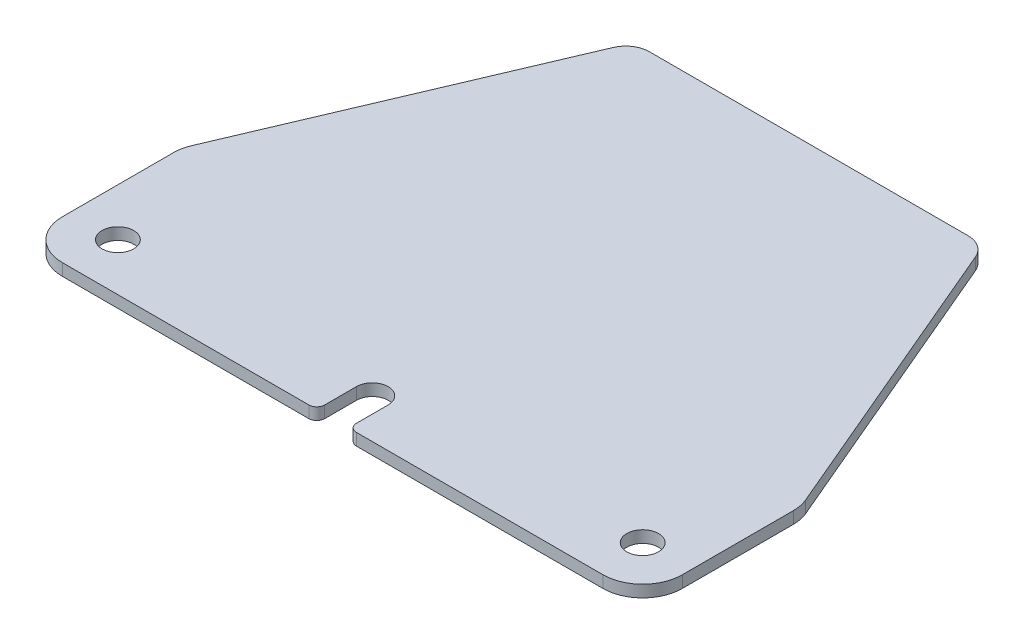
ISO-10303-21;
HEADER;
FILE_DESCRIPTION(('STEP AP214'),'2;1');
FILE_NAME('part.step','',(''),(''),'','','');
FILE_SCHEMA(('AUTOMOTIVE_DESIGN { 1 0 10303 214 1 1 1 1 }'));
ENDSEC;
DATA;
#1=APPLICATION_CONTEXT('core data for automotive mechanical design processes');
#2=APPLICATION_PROTOCOL_DEFINITION('international standard','automotive_design',2000,#1);
#3=PRODUCT_CONTEXT('',#1,'mechanical');
#4=PRODUCT('Part','Part','',(#3));
#5=PRODUCT_RELATED_PRODUCT_CATEGORY('part','',(#4));
#6=PRODUCT_DEFINITION_FORMATION('','',#4);
#7=PRODUCT_DEFINITION_CONTEXT('part definition',#1,'design');
#8=PRODUCT_DEFINITION('design','',#6,#7);
#9=PRODUCT_DEFINITION_SHAPE('','',#8);
#10=(LENGTH_UNIT() NAMED_UNIT(*) SI_UNIT(.MILLI.,.METRE.));
#11=(NAMED_UNIT(*) PLANE_ANGLE_UNIT() SI_UNIT($,.RADIAN.));
#12=(NAMED_UNIT(*) SI_UNIT($,.STERADIAN.) SOLID_ANGLE_UNIT());
#13=UNCERTAINTY_MEASURE_WITH_UNIT(LENGTH_MEASURE(1.E-05),#10,'distance_accuracy_value','');
#14=(GEOMETRIC_REPRESENTATION_CONTEXT(3) GLOBAL_UNCERTAINTY_ASSIGNED_CONTEXT((#13)) GLOBAL_UNIT_ASSIGNED_CONTEXT((#10,
#11,#12)) REPRESENTATION_CONTEXT('',''));
#15=CARTESIAN_POINT('',(0.,0.,0.));
#16=DIRECTION('',(0.,0.,1.));
#17=DIRECTION('',(1.,0.,0.));
#18=AXIS2_PLACEMENT_3D('',#15,#16,#17);
#19=CARTESIAN_POINT('',(-17.7,-1.5,60.));
#20=DIRECTION('',(0.,0.,1.));
#21=DIRECTION('',(1.,0.,0.));
#22=AXIS2_PLACEMENT_3D('',#19,#20,#21);
#23=PLANE('',#22);
#24=DIRECTION('',(1.,0.,0.));
#25=VECTOR('',#24,1.);
#26=CARTESIAN_POINT('',(-17.7,0.,60.));
#27=LINE('',#26,#25);
#28=CARTESIAN_POINT('',(2.99999999999999,0.,60.));
#29=VERTEX_POINT('',#28);
#30=CARTESIAN_POINT('',(34.0619458194133,1.00613961606655E-13,60.));
#31=VERTEX_POINT('',#30);
#32=EDGE_CURVE('E185',#29,#31,#27,.T.);
#33=ORIENTED_EDGE('',*,*,#32,.F.);
#34=DIRECTION('',(0.,1.,0.));
#35=VECTOR('',#34,1.);
#36=CARTESIAN_POINT('',(2.99999999999999,-1.5,60.));
#37=LINE('',#36,#35);
#38=CARTESIAN_POINT('',(2.99999999999999,-1.5,60.));
#39=VERTEX_POINT('',#38);
#40=EDGE_CURVE('E12',#29,#39,#37,.F.);
#41=ORIENTED_EDGE('',*,*,#40,.T.);
#42=DIRECTION('',(1.,0.,0.));
#43=VECTOR('',#42,1.);
#44=CARTESIAN_POINT('',(-17.7,-1.5,60.));
#45=LINE('',#44,#43);
#46=CARTESIAN_POINT('',(34.0619458194133,-1.4999999999999,60.));
#47=VERTEX_POINT('',#46);
#48=EDGE_CURVE('E345',#39,#47,#45,.T.);
#49=ORIENTED_EDGE('',*,*,#48,.T.);
#50=DIRECTION('',(0.,-1.,0.));
#51=VECTOR('',#50,1.);
#52=CARTESIAN_POINT('',(34.0619458194133,1.00613961606655E-13,60.));
#53=LINE('',#52,#51);
#54=EDGE_CURVE('E293',#31,#47,#53,.T.);
#55=ORIENTED_EDGE('',*,*,#54,.F.);
#56=EDGE_LOOP('',(#33,#41,#49,#55));
#57=FACE_BOUND('',#56,.T.);
#58=ADVANCED_FACE('F47',(#57),#23,.T.);
#59=CARTESIAN_POINT('',(0.,-1.5,0.));
#60=DIRECTION('',(0.,0.,-1.));
#61=DIRECTION('',(-1.,0.,0.));
#62=AXIS2_PLACEMENT_3D('',#59,#60,#61);
#63=PLANE('',#62);
#64=DIRECTION('',(-1.,0.,0.));
#65=VECTOR('',#64,1.);
#66=CARTESIAN_POINT('',(0.,-1.5,0.));
#67=LINE('',#66,#65);
#68=CARTESIAN_POINT('',(20.0772487475981,-1.49999999999999,0.));
#69=VERTEX_POINT('',#68);
#70=CARTESIAN_POINT('',(-20.0772487475981,-1.49999999999999,0.));
#71=VERTEX_POINT('',#70);
#72=EDGE_CURVE('E184',#69,#71,#67,.T.);
#73=ORIENTED_EDGE('',*,*,#72,.T.);
#74=DIRECTION('',(0.,1.,0.));
#75=VECTOR('',#74,1.);
#76=CARTESIAN_POINT('',(-20.0772487475981,0.,0.));
#77=LINE('',#76,#75);
#78=CARTESIAN_POINT('',(-20.0772487475981,0.,0.));
#79=VERTEX_POINT('',#78);
#80=EDGE_CURVE('E196',#71,#79,#77,.T.);
#81=ORIENTED_EDGE('',*,*,#80,.T.);
#82=DIRECTION('',(-1.,0.,0.));
#83=VECTOR('',#82,1.);
#84=CARTESIAN_POINT('',(0.,0.,0.));
#85=LINE('',#84,#83);
#86=CARTESIAN_POINT('',(20.0772487475981,0.,0.));
#87=VERTEX_POINT('',#86);
#88=EDGE_CURVE('E342',#87,#79,#85,.T.);
#89=ORIENTED_EDGE('',*,*,#88,.F.);
#90=DIRECTION('',(0.,1.,0.));
#91=VECTOR('',#90,1.);
#92=CARTESIAN_POINT('',(20.0772487475981,0.,0.));
#93=LINE('',#92,#91);
#94=EDGE_CURVE('E308',#69,#87,#93,.T.);
#95=ORIENTED_EDGE('',*,*,#94,.F.);
#96=EDGE_LOOP('',(#73,#81,#89,#95));
#97=FACE_BOUND('',#96,.T.);
#98=ADVANCED_FACE('F400',(#97),#63,.T.);
#99=CARTESIAN_POINT('',(0.,-1.5,0.));
#100=DIRECTION('',(0.,1.,0.));
#101=DIRECTION('',(0.,0.,1.));
#102=AXIS2_PLACEMENT_3D('',#99,#100,#101);
#103=PLANE('',#102);
#104=DIRECTION('',(0.,0.,-1.));
#105=VECTOR('',#104,1.);
#106=CARTESIAN_POINT('',(-1.99999999999999,-1.5,55.));
#107=LINE('',#106,#105);
#108=CARTESIAN_POINT('',(-1.99999999999999,-1.5,59.));
#109=VERTEX_POINT('',#108);
#110=CARTESIAN_POINT('',(-1.99999999999999,-1.5,55.));
#111=VERTEX_POINT('',#110);
#112=EDGE_CURVE('E323',#109,#111,#107,.T.);
#113=ORIENTED_EDGE('',*,*,#112,.F.);
#114=CARTESIAN_POINT('',(-2.99999999999999,-1.5,59.));
#115=DIRECTION('',(0.,1.,0.));
#116=DIRECTION('',(0.,0.,1.));
#117=AXIS2_PLACEMENT_3D('',#114,#115,#116);
#118=CIRCLE('',#117,1.);
#119=CARTESIAN_POINT('',(-2.99999999999999,-1.5,60.));
#120=VERTEX_POINT('',#119);
#121=EDGE_CURVE('E364',#109,#120,#118,.F.);
#122=ORIENTED_EDGE('',*,*,#121,.T.);
#123=CARTESIAN_POINT('',(-34.0619458194133,-1.4999999999999,60.));
#124=VERTEX_POINT('',#123);
#125=EDGE_CURVE('E346',#124,#120,#45,.T.);
#126=ORIENTED_EDGE('',*,*,#125,.F.);
#127=CARTESIAN_POINT('',(-34.0619458194133,-1.4999999999999,55.));
#128=DIRECTION('',(0.,-1.,0.));
#129=DIRECTION('',(1.,0.,0.));
#130=AXIS2_PLACEMENT_3D('',#127,#128,#129);
#131=CIRCLE('',#130,5.);
#132=CARTESIAN_POINT('',(-39.0619458194133,-1.49999999999987,55.));
#133=VERTEX_POINT('',#132);
#134=EDGE_CURVE('E200',#124,#133,#131,.T.);
#135=ORIENTED_EDGE('',*,*,#134,.T.);
#136=DIRECTION('',(0.,0.,1.));
#137=VECTOR('',#136,1.);
#138=CARTESIAN_POINT('',(-39.0619458194133,-1.49999999999987,60.));
#139=LINE('',#138,#137);
#140=CARTESIAN_POINT('',(-39.0619458194133,-1.49999999999986,41.018419889471));
#141=VERTEX_POINT('',#140);
#142=EDGE_CURVE('E240',#141,#133,#139,.T.);
#143=ORIENTED_EDGE('',*,*,#142,.F.);
#144=CARTESIAN_POINT('',(-34.0619458194133,-1.4999999999999,41.018419889471));
#145=DIRECTION('',(0.,-1.,0.));
#146=DIRECTION('',(1.,0.,0.));
#147=AXIS2_PLACEMENT_3D('',#144,#145,#146);
#148=CIRCLE('',#147,5.);
#149=CARTESIAN_POINT('',(-38.6636004117057,-1.49999999999986,39.0627166877468));
#150=VERTEX_POINT('',#149);
#151=EDGE_CURVE('E203',#141,#150,#148,.T.);
#152=ORIENTED_EDGE('',*,*,#151,.T.);
#153=DIRECTION('',(-0.391140640344853,0.,0.920330918458474));
#154=VECTOR('',#153,1.);
#155=CARTESIAN_POINT('',(-22.0619458194132,-1.49999999999997,0.));
#156=LINE('',#155,#154);
#157=CARTESIAN_POINT('',(-22.8382415029736,-1.49999999999997,1.82657807896544));
#158=VERTEX_POINT('',#157);
#159=EDGE_CURVE('E231',#158,#150,#156,.T.);
#160=ORIENTED_EDGE('',*,*,#159,.F.);
#161=CARTESIAN_POINT('',(-20.0772487475981,-1.49999999999999,3.));
#162=DIRECTION('',(0.,-1.,0.));
#163=DIRECTION('',(1.,0.,0.));
#164=AXIS2_PLACEMENT_3D('',#161,#162,#163);
#165=CIRCLE('',#164,3.);
#166=EDGE_CURVE('E215',#158,#71,#165,.T.);
#167=ORIENTED_EDGE('',*,*,#166,.T.);
#168=ORIENTED_EDGE('',*,*,#72,.F.);
#169=CARTESIAN_POINT('',(20.0772487475981,-1.49999999999999,3.));
#170=DIRECTION('',(0.,1.,0.));
#171=DIRECTION('',(-1.,0.,0.));
#172=AXIS2_PLACEMENT_3D('',#169,#170,#171);
#173=CIRCLE('',#172,3.);
#174=CARTESIAN_POINT('',(22.8382415029736,-1.49999999999997,1.82657807896544));
#175=VERTEX_POINT('',#174);
#176=EDGE_CURVE('E312',#175,#69,#173,.T.);
#177=ORIENTED_EDGE('',*,*,#176,.F.);
#178=DIRECTION('',(0.391140640344853,0.,0.920330918458474));
#179=VECTOR('',#178,1.);
#180=CARTESIAN_POINT('',(22.0619458194132,-1.49999999999997,0.));
#181=LINE('',#180,#179);
#182=CARTESIAN_POINT('',(38.6636004117057,-1.49999999999986,39.0627166877468));
#183=VERTEX_POINT('',#182);
#184=EDGE_CURVE('E256',#175,#183,#181,.T.);
#185=ORIENTED_EDGE('',*,*,#184,.T.);
#186=CARTESIAN_POINT('',(34.0619458194133,-1.4999999999999,41.018419889471));
#187=DIRECTION('',(0.,1.,0.));
#188=DIRECTION('',(-1.,0.,0.));
#189=AXIS2_PLACEMENT_3D('',#186,#187,#188);
#190=CIRCLE('',#189,5.);
#191=CARTESIAN_POINT('',(39.0619458194133,-1.49999999999986,41.018419889471));
#192=VERTEX_POINT('',#191);
#193=EDGE_CURVE('E278',#192,#183,#190,.T.);
#194=ORIENTED_EDGE('',*,*,#193,.F.);
#195=DIRECTION('',(0.,0.,1.));
#196=VECTOR('',#195,1.);
#197=CARTESIAN_POINT('',(39.0619458194133,-1.49999999999987,60.));
#198=LINE('',#197,#196);
#199=CARTESIAN_POINT('',(39.0619458194133,-1.49999999999987,55.));
#200=VERTEX_POINT('',#199);
#201=EDGE_CURVE('E252',#192,#200,#198,.T.);
#202=ORIENTED_EDGE('',*,*,#201,.T.);
#203=CARTESIAN_POINT('',(34.0619458194133,-1.4999999999999,55.));
#204=DIRECTION('',(0.,1.,0.));
#205=DIRECTION('',(-1.,0.,0.));
#206=AXIS2_PLACEMENT_3D('',#203,#204,#205);
#207=CIRCLE('',#206,5.);
#208=EDGE_CURVE('E289',#47,#200,#207,.T.);
#209=ORIENTED_EDGE('',*,*,#208,.F.);
#210=ORIENTED_EDGE('',*,*,#48,.F.);
#211=CARTESIAN_POINT('',(2.99999999999999,-1.5,59.));
#212=DIRECTION('',(0.,1.,0.));
#213=DIRECTION('',(0.,0.,1.));
#214=AXIS2_PLACEMENT_3D('',#211,#212,#213);
#215=CIRCLE('',#214,1.);
#216=CARTESIAN_POINT('',(1.99999999999999,-1.5,59.));
#217=VERTEX_POINT('',#216);
#218=EDGE_CURVE('E63',#39,#217,#215,.F.);
#219=ORIENTED_EDGE('',*,*,#218,.T.);
#220=DIRECTION('',(0.,0.,1.));
#221=VECTOR('',#220,1.);
#222=CARTESIAN_POINT('',(1.99999999999999,-1.5,55.));
#223=LINE('',#222,#221);
#224=CARTESIAN_POINT('',(1.99999999999999,-1.5,55.));
#225=VERTEX_POINT('',#224);
#226=EDGE_CURVE('E316',#225,#217,#223,.T.);
#227=ORIENTED_EDGE('',*,*,#226,.F.);
#228=CARTESIAN_POINT('',(0.,-1.5,55.));
#229=DIRECTION('',(0.,1.,0.));
#230=DIRECTION('',(0.,0.,1.));
#231=AXIS2_PLACEMENT_3D('',#228,#229,#230);
#232=CIRCLE('',#231,1.99999999999999);
#233=EDGE_CURVE('E319',#111,#225,#232,.F.);
#234=ORIENTED_EDGE('',*,*,#233,.F.);
#235=EDGE_LOOP('',(#113,#122,#126,#135,#143,#152,#160,#167,#168,#177,#185,#194,#202,#209,#210,
#219,#227,#234));
#236=FACE_BOUND('',#235,.T.);
#237=CARTESIAN_POINT('',(33.0619458194133,-1.49999999999991,54.));
#238=DIRECTION('',(0.,1.,0.));
#239=DIRECTION('',(-1.,0.,0.));
#240=AXIS2_PLACEMENT_3D('',#237,#238,#239);
#241=CIRCLE('',#240,2.);
#242=CARTESIAN_POINT('',(31.0619458194133,-1.49999999999992,54.));
#243=VERTEX_POINT('',#242);
#244=EDGE_CURVE('E260',#243,#243,#241,.F.);
#245=ORIENTED_EDGE('',*,*,#244,.F.);
#246=EDGE_LOOP('',(#245));
#247=FACE_BOUND('',#246,.T.);
#248=CARTESIAN_POINT('',(-33.0619458194133,-1.49999999999991,54.));
#249=DIRECTION('',(0.,-1.,0.));
#250=DIRECTION('',(1.,0.,0.));
#251=AXIS2_PLACEMENT_3D('',#248,#249,#250);
#252=CIRCLE('',#251,2.);
#253=CARTESIAN_POINT('',(-31.0619458194133,-1.49999999999992,54.));
#254=VERTEX_POINT('',#253);
#255=EDGE_CURVE('E219',#254,#254,#252,.F.);
#256=ORIENTED_EDGE('',*,*,#255,.T.);
#257=EDGE_LOOP('',(#256));
#258=FACE_BOUND('',#257,.T.);
#259=ADVANCED_FACE('F381',(#236,#247,#258),#103,.F.);
#260=CARTESIAN_POINT('',(0.,0.,0.));
#261=DIRECTION('',(0.,1.,0.));
#262=DIRECTION('',(0.,0.,1.));
#263=AXIS2_PLACEMENT_3D('',#260,#261,#262);
#264=PLANE('',#263);
#265=CARTESIAN_POINT('',(-34.0619458194133,1.00613961606655E-13,60.));
#266=VERTEX_POINT('',#265);
#267=CARTESIAN_POINT('',(-2.99999999999999,0.,60.));
#268=VERTEX_POINT('',#267);
#269=EDGE_CURVE('E174',#266,#268,#27,.T.);
#270=ORIENTED_EDGE('',*,*,#269,.T.);
#271=CARTESIAN_POINT('',(-2.99999999999999,0.,59.));
#272=DIRECTION('',(0.,1.,0.));
#273=DIRECTION('',(0.,0.,1.));
#274=AXIS2_PLACEMENT_3D('',#271,#272,#273);
#275=CIRCLE('',#274,1.);
#276=CARTESIAN_POINT('',(-1.99999999999999,0.,59.));
#277=VERTEX_POINT('',#276);
#278=EDGE_CURVE('E356',#268,#277,#275,.T.);
#279=ORIENTED_EDGE('',*,*,#278,.T.);
#280=DIRECTION('',(0.,0.,1.));
#281=VECTOR('',#280,1.);
#282=CARTESIAN_POINT('',(-1.99999999999999,0.,55.));
#283=LINE('',#282,#281);
#284=CARTESIAN_POINT('',(-1.99999999999999,0.,55.));
#285=VERTEX_POINT('',#284);
#286=EDGE_CURVE('E327',#285,#277,#283,.T.);
#287=ORIENTED_EDGE('',*,*,#286,.F.);
#288=CARTESIAN_POINT('',(0.,0.,55.));
#289=DIRECTION('',(0.,1.,0.));
#290=DIRECTION('',(0.,0.,1.));
#291=AXIS2_PLACEMENT_3D('',#288,#289,#290);
#292=CIRCLE('',#291,1.99999999999999);
#293=CARTESIAN_POINT('',(1.99999999999999,0.,55.));
#294=VERTEX_POINT('',#293);
#295=EDGE_CURVE('E251',#294,#285,#292,.T.);
#296=ORIENTED_EDGE('',*,*,#295,.F.);
#297=DIRECTION('',(0.,0.,-1.));
#298=VECTOR('',#297,1.);
#299=CARTESIAN_POINT('',(1.99999999999999,0.,55.));
#300=LINE('',#299,#298);
#301=CARTESIAN_POINT('',(1.99999999999999,0.,59.));
#302=VERTEX_POINT('',#301);
#303=EDGE_CURVE('E331',#302,#294,#300,.T.);
#304=ORIENTED_EDGE('',*,*,#303,.F.);
#305=CARTESIAN_POINT('',(2.99999999999999,0.,59.));
#306=DIRECTION('',(0.,1.,0.));
#307=DIRECTION('',(0.,0.,1.));
#308=AXIS2_PLACEMENT_3D('',#305,#306,#307);
#309=CIRCLE('',#308,1.);
#310=EDGE_CURVE('E353',#302,#29,#309,.T.);
#311=ORIENTED_EDGE('',*,*,#310,.T.);
#312=ORIENTED_EDGE('',*,*,#32,.T.);
#313=CARTESIAN_POINT('',(34.0619458194133,1.00613961606655E-13,55.));
#314=DIRECTION('',(0.,1.,0.));
#315=DIRECTION('',(-1.,0.,0.));
#316=AXIS2_PLACEMENT_3D('',#313,#314,#315);
#317=CIRCLE('',#316,5.);
#318=CARTESIAN_POINT('',(39.0619458194133,1.35308431126191E-13,55.));
#319=VERTEX_POINT('',#318);
#320=EDGE_CURVE('E297',#319,#31,#317,.F.);
#321=ORIENTED_EDGE('',*,*,#320,.F.);
#322=DIRECTION('',(0.,0.,1.));
#323=VECTOR('',#322,1.);
#324=CARTESIAN_POINT('',(39.0619458194133,1.35308431126191E-13,60.));
#325=LINE('',#324,#323);
#326=CARTESIAN_POINT('',(39.0619458194133,1.38777878078145E-13,41.018419889471));
#327=VERTEX_POINT('',#326);
#328=EDGE_CURVE('E282',#327,#319,#325,.T.);
#329=ORIENTED_EDGE('',*,*,#328,.F.);
#330=CARTESIAN_POINT('',(34.0619458194133,1.00613961606655E-13,41.018419889471));
#331=DIRECTION('',(0.,1.,0.));
#332=DIRECTION('',(-1.,0.,0.));
#333=AXIS2_PLACEMENT_3D('',#330,#331,#332);
#334=CIRCLE('',#333,5.);
#335=CARTESIAN_POINT('',(38.6636004117057,1.35308431126191E-13,39.0627166877468));
#336=VERTEX_POINT('',#335);
#337=EDGE_CURVE('E271',#336,#327,#334,.F.);
#338=ORIENTED_EDGE('',*,*,#337,.F.);
#339=DIRECTION('',(0.391140640344853,0.,0.920330918458474));
#340=VECTOR('',#339,1.);
#341=CARTESIAN_POINT('',(22.0619458194132,0.,0.));
#342=LINE('',#341,#340);
#343=CARTESIAN_POINT('',(22.8382415029735,0.,1.82657807896544));
#344=VERTEX_POINT('',#343);
#345=EDGE_CURVE('E264',#344,#336,#342,.T.);
#346=ORIENTED_EDGE('',*,*,#345,.F.);
#347=CARTESIAN_POINT('',(20.0772487475981,0.,3.));
#348=DIRECTION('',(0.,1.,0.));
#349=DIRECTION('',(-1.,0.,0.));
#350=AXIS2_PLACEMENT_3D('',#347,#348,#349);
#351=CIRCLE('',#350,3.);
#352=EDGE_CURVE('E304',#87,#344,#351,.F.);
#353=ORIENTED_EDGE('',*,*,#352,.F.);
#354=ORIENTED_EDGE('',*,*,#88,.T.);
#355=CARTESIAN_POINT('',(-20.0772487475981,0.,3.));
#356=DIRECTION('',(0.,-1.,0.));
#357=DIRECTION('',(1.,0.,0.));
#358=AXIS2_PLACEMENT_3D('',#355,#356,#357);
#359=CIRCLE('',#358,3.);
#360=CARTESIAN_POINT('',(-22.8382415029735,0.,1.82657807896544));
#361=VERTEX_POINT('',#360);
#362=EDGE_CURVE('E202',#79,#361,#359,.F.);
#363=ORIENTED_EDGE('',*,*,#362,.T.);
#364=DIRECTION('',(-0.391140640344853,0.,0.920330918458474));
#365=VECTOR('',#364,1.);
#366=CARTESIAN_POINT('',(-22.0619458194132,0.,0.));
#367=LINE('',#366,#365);
#368=CARTESIAN_POINT('',(-38.6636004117057,1.35308431126191E-13,39.0627166877468));
#369=VERTEX_POINT('',#368);
#370=EDGE_CURVE('E207',#361,#369,#367,.T.);
#371=ORIENTED_EDGE('',*,*,#370,.T.);
#372=CARTESIAN_POINT('',(-34.0619458194133,1.00613961606655E-13,41.018419889471));
#373=DIRECTION('',(0.,-1.,0.));
#374=DIRECTION('',(1.,0.,0.));
#375=AXIS2_PLACEMENT_3D('',#372,#373,#374);
#376=CIRCLE('',#375,5.);
#377=CARTESIAN_POINT('',(-39.0619458194133,1.38777878078145E-13,41.018419889471));
#378=VERTEX_POINT('',#377);
#379=EDGE_CURVE('E636',#369,#378,#376,.F.);
#380=ORIENTED_EDGE('',*,*,#379,.T.);
#381=DIRECTION('',(0.,0.,1.));
#382=VECTOR('',#381,1.);
#383=CARTESIAN_POINT('',(-39.0619458194133,1.35308431126191E-13,60.));
#384=LINE('',#383,#382);
#385=CARTESIAN_POINT('',(-39.0619458194133,1.35308431126191E-13,55.));
#386=VERTEX_POINT('',#385);
#387=EDGE_CURVE('E192',#378,#386,#384,.T.);
#388=ORIENTED_EDGE('',*,*,#387,.T.);
#389=CARTESIAN_POINT('',(-34.0619458194133,1.00613961606655E-13,55.));
#390=DIRECTION('',(0.,-1.,0.));
#391=DIRECTION('',(1.,0.,0.));
#392=AXIS2_PLACEMENT_3D('',#389,#390,#391);
#393=CIRCLE('',#392,5.);
#394=EDGE_CURVE('E189',#386,#266,#393,.F.);
#395=ORIENTED_EDGE('',*,*,#394,.T.);
#396=EDGE_LOOP('',(#270,#279,#287,#296,#304,#311,#312,#321,#329,#338,#346,#353,#354,#363,#371,
#380,#388,#395));
#397=FACE_BOUND('',#396,.T.);
#398=CARTESIAN_POINT('',(33.0619458194133,0.,54.));
#399=DIRECTION('',(0.,-1.,0.));
#400=DIRECTION('',(1.,0.,0.));
#401=AXIS2_PLACEMENT_3D('',#398,#399,#400);
#402=CIRCLE('',#401,2.);
#403=CARTESIAN_POINT('',(35.0619458194133,1.04127477332387E-13,54.));
#404=VERTEX_POINT('',#403);
#405=EDGE_CURVE('E247',#404,#404,#402,.T.);
#406=ORIENTED_EDGE('',*,*,#405,.T.);
#407=EDGE_LOOP('',(#406));
#408=FACE_BOUND('',#407,.T.);
#409=CARTESIAN_POINT('',(-33.0619458194133,0.,54.));
#410=DIRECTION('',(0.,1.,0.));
#411=DIRECTION('',(-1.,0.,0.));
#412=AXIS2_PLACEMENT_3D('',#409,#410,#411);
#413=CIRCLE('',#412,2.);
#414=CARTESIAN_POINT('',(-35.0619458194133,1.04127477332387E-13,54.));
#415=VERTEX_POINT('',#414);
#416=EDGE_CURVE('E223',#415,#415,#413,.T.);
#417=ORIENTED_EDGE('',*,*,#416,.F.);
#418=EDGE_LOOP('',(#417));
#419=FACE_BOUND('',#418,.T.);
#420=ADVANCED_FACE('F49',(#397,#408,#419),#264,.T.);
#421=ORIENTED_EDGE('',*,*,#125,.T.);
#422=DIRECTION('',(0.,1.,0.));
#423=VECTOR('',#422,1.);
#424=CARTESIAN_POINT('',(-2.99999999999999,0.,60.));
#425=LINE('',#424,#423);
#426=EDGE_CURVE('E181',#120,#268,#425,.T.);
#427=ORIENTED_EDGE('',*,*,#426,.T.);
#428=ORIENTED_EDGE('',*,*,#269,.F.);
#429=DIRECTION('',(0.,-1.,0.));
#430=VECTOR('',#429,1.);
#431=CARTESIAN_POINT('',(-34.0619458194133,1.00613961606655E-13,60.));
#432=LINE('',#431,#430);
#433=EDGE_CURVE('E179',#266,#124,#432,.T.);
#434=ORIENTED_EDGE('',*,*,#433,.T.);
#435=EDGE_LOOP('',(#421,#427,#428,#434));
#436=FACE_BOUND('',#435,.T.);
#437=ADVANCED_FACE('F177',(#436),#23,.T.);
#438=CARTESIAN_POINT('',(0.,-9.56225774829854,55.));
#439=DIRECTION('',(0.,1.,0.));
#440=DIRECTION('',(0.,0.,1.));
#441=AXIS2_PLACEMENT_3D('',#438,#439,#440);
#442=CYLINDRICAL_SURFACE('',#441,1.99999999999999);
#443=ORIENTED_EDGE('',*,*,#233,.T.);
#444=DIRECTION('',(0.,1.,0.));
#445=VECTOR('',#444,1.);
#446=CARTESIAN_POINT('',(1.99999999999999,-9.56225774829854,55.));
#447=LINE('',#446,#445);
#448=EDGE_CURVE('E320',#225,#294,#447,.T.);
#449=ORIENTED_EDGE('',*,*,#448,.T.);
#450=ORIENTED_EDGE('',*,*,#295,.T.);
#451=DIRECTION('',(0.,1.,0.));
#452=VECTOR('',#451,1.);
#453=CARTESIAN_POINT('',(-1.99999999999999,-9.56225774829854,55.));
#454=LINE('',#453,#452);
#455=EDGE_CURVE('E334',#111,#285,#454,.T.);
#456=ORIENTED_EDGE('',*,*,#455,.F.);
#457=EDGE_LOOP('',(#443,#449,#450,#456));
#458=FACE_BOUND('',#457,.T.);
#459=ADVANCED_FACE('F378',(#458),#442,.F.);
#460=CARTESIAN_POINT('',(1.99999999999999,-9.56225774829854,55.));
#461=DIRECTION('',(1.,0.,0.));
#462=DIRECTION('',(0.,0.,-1.));
#463=AXIS2_PLACEMENT_3D('',#460,#461,#462);
#464=PLANE('',#463);
#465=ORIENTED_EDGE('',*,*,#226,.T.);
#466=DIRECTION('',(0.,1.,0.));
#467=VECTOR('',#466,1.);
#468=CARTESIAN_POINT('',(1.99999999999999,0.,59.));
#469=LINE('',#468,#467);
#470=EDGE_CURVE('E56',#217,#302,#469,.T.);
#471=ORIENTED_EDGE('',*,*,#470,.T.);
#472=ORIENTED_EDGE('',*,*,#303,.T.);
#473=ORIENTED_EDGE('',*,*,#448,.F.);
#474=EDGE_LOOP('',(#465,#471,#472,#473));
#475=FACE_BOUND('',#474,.T.);
#476=ADVANCED_FACE('F371',(#475),#464,.F.);
#477=CARTESIAN_POINT('',(-1.99999999999999,-9.56225774829854,55.));
#478=DIRECTION('',(-1.,0.,0.));
#479=DIRECTION('',(0.,0.,1.));
#480=AXIS2_PLACEMENT_3D('',#477,#478,#479);
#481=PLANE('',#480);
#482=ORIENTED_EDGE('',*,*,#286,.T.);
#483=DIRECTION('',(0.,1.,0.));
#484=VECTOR('',#483,1.);
#485=CARTESIAN_POINT('',(-1.99999999999999,-1.5,59.));
#486=LINE('',#485,#484);
#487=EDGE_CURVE('E359',#277,#109,#486,.F.);
#488=ORIENTED_EDGE('',*,*,#487,.T.);
#489=ORIENTED_EDGE('',*,*,#112,.T.);
#490=ORIENTED_EDGE('',*,*,#455,.T.);
#491=EDGE_LOOP('',(#482,#488,#489,#490));
#492=FACE_BOUND('',#491,.T.);
#493=ADVANCED_FACE('F388',(#492),#481,.F.);
#494=CARTESIAN_POINT('',(-2.99999999999999,-1.5,59.));
#495=DIRECTION('',(0.,-1.,0.));
#496=DIRECTION('',(0.,0.,-1.));
#497=AXIS2_PLACEMENT_3D('',#494,#495,#496);
#498=CYLINDRICAL_SURFACE('',#497,1.);
#499=ORIENTED_EDGE('',*,*,#121,.F.);
#500=ORIENTED_EDGE('',*,*,#487,.F.);
#501=ORIENTED_EDGE('',*,*,#278,.F.);
#502=ORIENTED_EDGE('',*,*,#426,.F.);
#503=EDGE_LOOP('',(#499,#500,#501,#502));
#504=FACE_BOUND('',#503,.T.);
#505=ADVANCED_FACE('F387',(#504),#498,.T.);
#506=CARTESIAN_POINT('',(2.99999999999999,-9.56225774829854,59.));
#507=DIRECTION('',(0.,-1.,0.));
#508=DIRECTION('',(0.,0.,-1.));
#509=AXIS2_PLACEMENT_3D('',#506,#507,#508);
#510=CYLINDRICAL_SURFACE('',#509,1.);
#511=ORIENTED_EDGE('',*,*,#218,.F.);
#512=ORIENTED_EDGE('',*,*,#40,.F.);
#513=ORIENTED_EDGE('',*,*,#310,.F.);
#514=ORIENTED_EDGE('',*,*,#470,.F.);
#515=EDGE_LOOP('',(#511,#512,#513,#514));
#516=FACE_BOUND('',#515,.T.);
#517=ADVANCED_FACE('F395',(#516),#510,.T.);
#518=CARTESIAN_POINT('',(20.0772487475981,0.,3.));
#519=DIRECTION('',(0.,-1.,0.));
#520=DIRECTION('',(-1.,0.,0.));
#521=AXIS2_PLACEMENT_3D('',#518,#519,#520);
#522=CYLINDRICAL_SURFACE('',#521,3.);
#523=ORIENTED_EDGE('',*,*,#176,.T.);
#524=ORIENTED_EDGE('',*,*,#94,.T.);
#525=ORIENTED_EDGE('',*,*,#352,.T.);
#526=DIRECTION('',(0.,1.,0.));
#527=VECTOR('',#526,1.);
#528=CARTESIAN_POINT('',(22.8382415029736,-1.49999999999994,1.82657807896544));
#529=LINE('',#528,#527);
#530=EDGE_CURVE('E301',#344,#175,#529,.F.);
#531=ORIENTED_EDGE('',*,*,#530,.T.);
#532=EDGE_LOOP('',(#523,#524,#525,#531));
#533=FACE_BOUND('',#532,.T.);
#534=ADVANCED_FACE('F607',(#533),#522,.T.);
#535=CARTESIAN_POINT('',(34.0619458194133,1.00613961606655E-13,55.));
#536=DIRECTION('',(0.,-1.,0.));
#537=DIRECTION('',(-1.,0.,0.));
#538=AXIS2_PLACEMENT_3D('',#535,#536,#537);
#539=CYLINDRICAL_SURFACE('',#538,5.);
#540=ORIENTED_EDGE('',*,*,#320,.T.);
#541=ORIENTED_EDGE('',*,*,#54,.T.);
#542=ORIENTED_EDGE('',*,*,#208,.T.);
#543=DIRECTION('',(0.,-1.,0.));
#544=VECTOR('',#543,1.);
#545=CARTESIAN_POINT('',(39.0619458194133,1.35308431126191E-13,55.));
#546=LINE('',#545,#544);
#547=EDGE_CURVE('E286',#200,#319,#546,.F.);
#548=ORIENTED_EDGE('',*,*,#547,.T.);
#549=EDGE_LOOP('',(#540,#541,#542,#548));
#550=FACE_BOUND('',#549,.T.);
#551=ADVANCED_FACE('F542',(#550),#539,.T.);
#552=CARTESIAN_POINT('',(39.0619458194133,1.35308431126191E-13,60.));
#553=DIRECTION('',(-1.,0.,0.));
#554=DIRECTION('',(0.,1.,0.));
#555=AXIS2_PLACEMENT_3D('',#552,#553,#554);
#556=PLANE('',#555);
#557=ORIENTED_EDGE('',*,*,#328,.T.);
#558=ORIENTED_EDGE('',*,*,#547,.F.);
#559=ORIENTED_EDGE('',*,*,#201,.F.);
#560=DIRECTION('',(0.,1.,0.));
#561=VECTOR('',#560,1.);
#562=CARTESIAN_POINT('',(39.0619458194133,-1.49999999999988,41.018419889471));
#563=LINE('',#562,#561);
#564=EDGE_CURVE('E268',#327,#192,#563,.F.);
#565=ORIENTED_EDGE('',*,*,#564,.F.);
#566=EDGE_LOOP('',(#557,#558,#559,#565));
#567=FACE_BOUND('',#566,.T.);
#568=ADVANCED_FACE('F536',(#567),#556,.F.);
#569=CARTESIAN_POINT('',(34.0619458194136,-44.9626276242014,41.018419889471));
#570=DIRECTION('',(0.,-1.,0.));
#571=DIRECTION('',(-1.,0.,0.));
#572=AXIS2_PLACEMENT_3D('',#569,#570,#571);
#573=CYLINDRICAL_SURFACE('',#572,5.);
#574=ORIENTED_EDGE('',*,*,#193,.T.);
#575=DIRECTION('',(0.,1.,0.));
#576=VECTOR('',#575,1.);
#577=CARTESIAN_POINT('',(38.6636004117057,1.14491749414469E-13,39.0627166877467));
#578=LINE('',#577,#576);
#579=EDGE_CURVE('E275',#183,#336,#578,.T.);
#580=ORIENTED_EDGE('',*,*,#579,.T.);
#581=ORIENTED_EDGE('',*,*,#337,.T.);
#582=ORIENTED_EDGE('',*,*,#564,.T.);
#583=EDGE_LOOP('',(#574,#580,#581,#582));
#584=FACE_BOUND('',#583,.T.);
#585=ADVANCED_FACE('F541',(#584),#573,.T.);
#586=CARTESIAN_POINT('',(22.0619458194135,-44.9626276242015,0.));
#587=DIRECTION('',(0.920330918458474,0.,-0.391140640344853));
#588=DIRECTION('',(-0.391140640344853,0.,-0.920330918458474));
#589=AXIS2_PLACEMENT_3D('',#586,#587,#588);
#590=PLANE('',#589);
#591=ORIENTED_EDGE('',*,*,#345,.T.);
#592=ORIENTED_EDGE('',*,*,#579,.F.);
#593=ORIENTED_EDGE('',*,*,#184,.F.);
#594=ORIENTED_EDGE('',*,*,#530,.F.);
#595=EDGE_LOOP('',(#591,#592,#593,#594));
#596=FACE_BOUND('',#595,.T.);
#597=ADVANCED_FACE('F550',(#596),#590,.T.);
#598=CARTESIAN_POINT('',(33.0619458194134,-7.1568542494923,54.));
#599=DIRECTION('',(0.,1.,0.));
#600=DIRECTION('',(1.,0.,0.));
#601=AXIS2_PLACEMENT_3D('',#598,#599,#600);
#602=CYLINDRICAL_SURFACE('',#601,2.);
#603=ORIENTED_EDGE('',*,*,#405,.F.);
#604=EDGE_LOOP('',(#603));
#605=FACE_BOUND('',#604,.T.);
#606=ORIENTED_EDGE('',*,*,#244,.T.);
#607=EDGE_LOOP('',(#606));
#608=FACE_BOUND('',#607,.T.);
#609=ADVANCED_FACE('F555',(#605,#608),#602,.F.);
#610=CARTESIAN_POINT('',(-34.0619458194136,-44.9626276242014,41.018419889471));
#611=DIRECTION('',(0.,-1.,0.));
#612=DIRECTION('',(1.,0.,0.));
#613=AXIS2_PLACEMENT_3D('',#610,#611,#612);
#614=CYLINDRICAL_SURFACE('',#613,5.);
#615=ORIENTED_EDGE('',*,*,#151,.F.);
#616=DIRECTION('',(0.,1.,0.));
#617=VECTOR('',#616,1.);
#618=CARTESIAN_POINT('',(-39.0619458194133,-1.49999999999988,41.018419889471));
#619=LINE('',#618,#617);
#620=EDGE_CURVE('E244',#378,#141,#619,.F.);
#621=ORIENTED_EDGE('',*,*,#620,.F.);
#622=ORIENTED_EDGE('',*,*,#379,.F.);
#623=DIRECTION('',(0.,1.,0.));
#624=VECTOR('',#623,1.);
#625=CARTESIAN_POINT('',(-38.6636004117057,1.14491749414469E-13,39.0627166877467));
#626=LINE('',#625,#624);
#627=EDGE_CURVE('E227',#150,#369,#626,.T.);
#628=ORIENTED_EDGE('',*,*,#627,.F.);
#629=EDGE_LOOP('',(#615,#621,#622,#628));
#630=FACE_BOUND('',#629,.T.);
#631=ADVANCED_FACE('F565',(#630),#614,.T.);
#632=CARTESIAN_POINT('',(-39.0619458194133,1.35308431126191E-13,60.));
#633=DIRECTION('',(1.,0.,0.));
#634=DIRECTION('',(0.,1.,0.));
#635=AXIS2_PLACEMENT_3D('',#632,#633,#634);
#636=PLANE('',#635);
#637=ORIENTED_EDGE('',*,*,#387,.F.);
#638=ORIENTED_EDGE('',*,*,#620,.T.);
#639=ORIENTED_EDGE('',*,*,#142,.T.);
#640=DIRECTION('',(0.,-1.,0.));
#641=VECTOR('',#640,1.);
#642=CARTESIAN_POINT('',(-39.0619458194133,1.35308431126191E-13,55.));
#643=LINE('',#642,#641);
#644=EDGE_CURVE('E237',#133,#386,#643,.F.);
#645=ORIENTED_EDGE('',*,*,#644,.T.);
#646=EDGE_LOOP('',(#637,#638,#639,#645));
#647=FACE_BOUND('',#646,.T.);
#648=ADVANCED_FACE('F572',(#647),#636,.F.);
#649=CARTESIAN_POINT('',(-34.0619458194133,1.00613961606655E-13,55.));
#650=DIRECTION('',(0.,-1.,0.));
#651=DIRECTION('',(1.,0.,0.));
#652=AXIS2_PLACEMENT_3D('',#649,#650,#651);
#653=CYLINDRICAL_SURFACE('',#652,5.);
#654=ORIENTED_EDGE('',*,*,#394,.F.);
#655=ORIENTED_EDGE('',*,*,#644,.F.);
#656=ORIENTED_EDGE('',*,*,#134,.F.);
#657=ORIENTED_EDGE('',*,*,#433,.F.);
#658=EDGE_LOOP('',(#654,#655,#656,#657));
#659=FACE_BOUND('',#658,.T.);
#660=ADVANCED_FACE('F199',(#659),#653,.T.);
#661=CARTESIAN_POINT('',(-20.0772487475981,0.,3.));
#662=DIRECTION('',(0.,-1.,0.));
#663=DIRECTION('',(1.,0.,0.));
#664=AXIS2_PLACEMENT_3D('',#661,#662,#663);
#665=CYLINDRICAL_SURFACE('',#664,3.);
#666=ORIENTED_EDGE('',*,*,#166,.F.);
#667=DIRECTION('',(0.,1.,0.));
#668=VECTOR('',#667,1.);
#669=CARTESIAN_POINT('',(-22.8382415029736,-1.49999999999994,1.82657807896544));
#670=LINE('',#669,#668);
#671=EDGE_CURVE('E234',#361,#158,#670,.F.);
#672=ORIENTED_EDGE('',*,*,#671,.F.);
#673=ORIENTED_EDGE('',*,*,#362,.F.);
#674=ORIENTED_EDGE('',*,*,#80,.F.);
#675=EDGE_LOOP('',(#666,#672,#673,#674));
#676=FACE_BOUND('',#675,.T.);
#677=ADVANCED_FACE('F587',(#676),#665,.T.);
#678=CARTESIAN_POINT('',(-22.0619458194135,-44.9626276242015,0.));
#679=DIRECTION('',(-0.920330918458474,0.,-0.391140640344853));
#680=DIRECTION('',(0.391140640344853,0.,-0.920330918458474));
#681=AXIS2_PLACEMENT_3D('',#678,#679,#680);
#682=PLANE('',#681);
#683=ORIENTED_EDGE('',*,*,#370,.F.);
#684=ORIENTED_EDGE('',*,*,#671,.T.);
#685=ORIENTED_EDGE('',*,*,#159,.T.);
#686=ORIENTED_EDGE('',*,*,#627,.T.);
#687=EDGE_LOOP('',(#683,#684,#685,#686));
#688=FACE_BOUND('',#687,.T.);
#689=ADVANCED_FACE('F582',(#688),#682,.T.);
#690=CARTESIAN_POINT('',(-33.0619458194134,-7.1568542494923,54.));
#691=DIRECTION('',(0.,1.,0.));
#692=DIRECTION('',(-1.,0.,0.));
#693=AXIS2_PLACEMENT_3D('',#690,#691,#692);
#694=CYLINDRICAL_SURFACE('',#693,2.);
#695=ORIENTED_EDGE('',*,*,#416,.T.);
#696=EDGE_LOOP('',(#695));
#697=FACE_BOUND('',#696,.T.);
#698=ORIENTED_EDGE('',*,*,#255,.F.);
#699=EDGE_LOOP('',(#698));
#700=FACE_BOUND('',#699,.T.);
#701=ADVANCED_FACE('F482',(#697,#700),#694,.F.);
#702=CLOSED_SHELL('',(#58,#98,#259,#420,#437,#459,#476,#493,#505,#517,#534,#551,#568,#585,#597,
#609,#631,#648,#660,#677,#689,#701));
#703=MANIFOLD_SOLID_BREP('B2',#702);
#704=ADVANCED_BREP_SHAPE_REPRESENTATION('',(#18,#703),#14);
#705=SHAPE_DEFINITION_REPRESENTATION(#9,#704);
ENDSEC;
END-ISO-10303-21;
